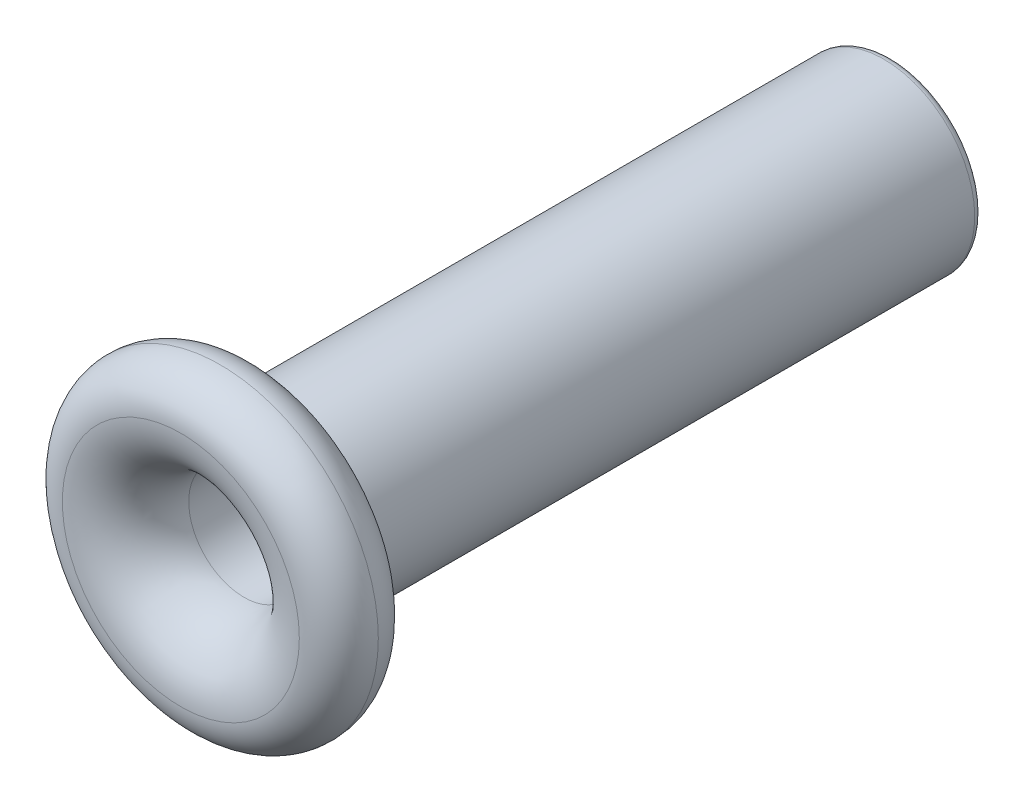
ISO-10303-21;
HEADER;
FILE_DESCRIPTION(('STEP AP214'),'2;1');
FILE_NAME('part.step','',(''),(''),'','','');
FILE_SCHEMA(('AUTOMOTIVE_DESIGN { 1 0 10303 214 1 1 1 1 }'));
ENDSEC;
DATA;
#1=APPLICATION_CONTEXT('core data for automotive mechanical design processes');
#2=APPLICATION_PROTOCOL_DEFINITION('international standard','automotive_design',2000,#1);
#3=PRODUCT_CONTEXT('',#1,'mechanical');
#4=PRODUCT('Part','Part','',(#3));
#5=PRODUCT_RELATED_PRODUCT_CATEGORY('part','',(#4));
#6=PRODUCT_DEFINITION_FORMATION('','',#4);
#7=PRODUCT_DEFINITION_CONTEXT('part definition',#1,'design');
#8=PRODUCT_DEFINITION('design','',#6,#7);
#9=PRODUCT_DEFINITION_SHAPE('','',#8);
#10=(LENGTH_UNIT() NAMED_UNIT(*) SI_UNIT(.MILLI.,.METRE.));
#11=(NAMED_UNIT(*) PLANE_ANGLE_UNIT() SI_UNIT($,.RADIAN.));
#12=(NAMED_UNIT(*) SI_UNIT($,.STERADIAN.) SOLID_ANGLE_UNIT());
#13=UNCERTAINTY_MEASURE_WITH_UNIT(LENGTH_MEASURE(1.E-05),#10,'distance_accuracy_value','');
#14=(GEOMETRIC_REPRESENTATION_CONTEXT(3) GLOBAL_UNCERTAINTY_ASSIGNED_CONTEXT((#13)) GLOBAL_UNIT_ASSIGNED_CONTEXT((#10,
#11,#12)) REPRESENTATION_CONTEXT('',''));
#15=CARTESIAN_POINT('',(0.,0.,0.));
#16=DIRECTION('',(0.,0.,1.));
#17=DIRECTION('',(1.,0.,0.));
#18=AXIS2_PLACEMENT_3D('',#15,#16,#17);
#19=CARTESIAN_POINT('',(0.,0.,80.));
#20=DIRECTION('',(0.,0.,-1.));
#21=DIRECTION('',(-1.,0.,0.));
#22=AXIS2_PLACEMENT_3D('',#19,#20,#21);
#23=CYLINDRICAL_SURFACE('',#22,11.5);
#24=CARTESIAN_POINT('',(0.,0.,1.));
#25=DIRECTION('',(0.,0.,1.));
#26=DIRECTION('',(1.,0.,0.));
#27=AXIS2_PLACEMENT_3D('',#24,#25,#26);
#28=CIRCLE('',#27,11.5);
#29=CARTESIAN_POINT('',(11.5,0.,1.));
#30=VERTEX_POINT('',#29);
#31=EDGE_CURVE('E70',#30,#30,#28,.T.);
#32=ORIENTED_EDGE('',*,*,#31,.T.);
#33=EDGE_LOOP('',(#32));
#34=FACE_BOUND('',#33,.T.);
#35=CARTESIAN_POINT('',(0.,0.,80.));
#36=DIRECTION('',(0.,0.,1.));
#37=DIRECTION('',(1.,0.,0.));
#38=AXIS2_PLACEMENT_3D('',#35,#36,#37);
#39=CIRCLE('',#38,11.5);
#40=CARTESIAN_POINT('',(11.5,0.,80.));
#41=VERTEX_POINT('',#40);
#42=EDGE_CURVE('E51',#41,#41,#39,.T.);
#43=ORIENTED_EDGE('',*,*,#42,.F.);
#44=EDGE_LOOP('',(#43));
#45=FACE_BOUND('',#44,.T.);
#46=ADVANCED_FACE('F31',(#34,#45),#23,.T.);
#47=CARTESIAN_POINT('',(0.,0.,0.));
#48=DIRECTION('',(0.,0.,1.));
#49=DIRECTION('',(1.,0.,0.));
#50=AXIS2_PLACEMENT_3D('',#47,#48,#49);
#51=PLANE('',#50);
#52=CARTESIAN_POINT('',(0.,0.,0.));
#53=DIRECTION('',(0.,0.,1.));
#54=DIRECTION('',(1.,0.,0.));
#55=AXIS2_PLACEMENT_3D('',#52,#53,#54);
#56=CIRCLE('',#55,10.5);
#57=CARTESIAN_POINT('',(10.5,0.,0.));
#58=VERTEX_POINT('',#57);
#59=EDGE_CURVE('E64',#58,#58,#56,.F.);
#60=ORIENTED_EDGE('',*,*,#59,.T.);
#61=EDGE_LOOP('',(#60));
#62=FACE_BOUND('',#61,.T.);
#63=CARTESIAN_POINT('',(0.,0.,0.));
#64=DIRECTION('',(0.,0.,1.));
#65=DIRECTION('',(1.,0.,0.));
#66=AXIS2_PLACEMENT_3D('',#63,#64,#65);
#67=CIRCLE('',#66,10.);
#68=CARTESIAN_POINT('',(10.,0.,0.));
#69=VERTEX_POINT('',#68);
#70=EDGE_CURVE('E67',#69,#69,#67,.T.);
#71=ORIENTED_EDGE('',*,*,#70,.T.);
#72=EDGE_LOOP('',(#71));
#73=FACE_BOUND('',#72,.T.);
#74=ADVANCED_FACE('F79',(#62,#73),#51,.F.);
#75=CARTESIAN_POINT('',(0.,0.,10.));
#76=DIRECTION('',(0.,0.,-1.));
#77=DIRECTION('',(-1.,0.,0.));
#78=AXIS2_PLACEMENT_3D('',#75,#76,#77);
#79=CYLINDRICAL_SURFACE('',#78,9.);
#80=CARTESIAN_POINT('',(0.,0.,9.));
#81=DIRECTION('',(0.,0.,-1.));
#82=DIRECTION('',(-1.,0.,0.));
#83=AXIS2_PLACEMENT_3D('',#80,#81,#82);
#84=CIRCLE('',#83,9.);
#85=CARTESIAN_POINT('',(-9.,0.,9.));
#86=VERTEX_POINT('',#85);
#87=EDGE_CURVE('E55',#86,#86,#84,.F.);
#88=ORIENTED_EDGE('',*,*,#87,.T.);
#89=EDGE_LOOP('',(#88));
#90=FACE_BOUND('',#89,.T.);
#91=CARTESIAN_POINT('',(0.,0.,0.999999999999999));
#92=DIRECTION('',(0.,0.,1.));
#93=DIRECTION('',(1.,0.,0.));
#94=AXIS2_PLACEMENT_3D('',#91,#92,#93);
#95=CIRCLE('',#94,9.);
#96=CARTESIAN_POINT('',(9.,0.,0.999999999999999));
#97=VERTEX_POINT('',#96);
#98=EDGE_CURVE('E61',#97,#97,#95,.F.);
#99=ORIENTED_EDGE('',*,*,#98,.T.);
#100=EDGE_LOOP('',(#99));
#101=FACE_BOUND('',#100,.T.);
#102=ADVANCED_FACE('F85',(#90,#101),#79,.F.);
#103=CARTESIAN_POINT('',(0.,0.,10.));
#104=DIRECTION('',(0.,0.,-1.));
#105=DIRECTION('',(-1.,0.,0.));
#106=AXIS2_PLACEMENT_3D('',#103,#104,#105);
#107=PLANE('',#106);
#108=CARTESIAN_POINT('',(0.,0.,10.));
#109=DIRECTION('',(0.,0.,-1.));
#110=DIRECTION('',(-1.,0.,0.));
#111=AXIS2_PLACEMENT_3D('',#108,#109,#110);
#112=CIRCLE('',#111,8.);
#113=CARTESIAN_POINT('',(-8.,0.,10.));
#114=VERTEX_POINT('',#113);
#115=EDGE_CURVE('E58',#114,#114,#112,.T.);
#116=ORIENTED_EDGE('',*,*,#115,.T.);
#117=EDGE_LOOP('',(#116));
#118=FACE_BOUND('',#117,.T.);
#119=ADVANCED_FACE('F94',(#118),#107,.T.);
#120=CARTESIAN_POINT('',(0.,0.,1.));
#121=DIRECTION('',(0.,0.,1.));
#122=DIRECTION('',(1.,0.,0.));
#123=AXIS2_PLACEMENT_3D('',#120,#121,#122);
#124=TOROIDAL_SURFACE('',#123,10.5,1.);
#125=ORIENTED_EDGE('',*,*,#59,.F.);
#126=EDGE_LOOP('',(#125));
#127=FACE_BOUND('',#126,.T.);
#128=ORIENTED_EDGE('',*,*,#31,.F.);
#129=EDGE_LOOP('',(#128));
#130=FACE_BOUND('',#129,.T.);
#131=ADVANCED_FACE('F90',(#127,#130),#124,.T.);
#132=CARTESIAN_POINT('',(0.,0.,0.999999999999999));
#133=DIRECTION('',(0.,0.,1.));
#134=DIRECTION('',(1.,0.,0.));
#135=AXIS2_PLACEMENT_3D('',#132,#133,#134);
#136=TOROIDAL_SURFACE('',#135,10.,1.);
#137=ORIENTED_EDGE('',*,*,#70,.F.);
#138=EDGE_LOOP('',(#137));
#139=FACE_BOUND('',#138,.T.);
#140=ORIENTED_EDGE('',*,*,#98,.F.);
#141=EDGE_LOOP('',(#140));
#142=FACE_BOUND('',#141,.T.);
#143=ADVANCED_FACE('F93',(#139,#142),#136,.T.);
#144=CARTESIAN_POINT('',(0.,0.,9.));
#145=DIRECTION('',(0.,0.,-1.));
#146=DIRECTION('',(-1.,0.,0.));
#147=AXIS2_PLACEMENT_3D('',#144,#145,#146);
#148=TOROIDAL_SURFACE('',#147,8.,1.);
#149=ORIENTED_EDGE('',*,*,#87,.F.);
#150=EDGE_LOOP('',(#149));
#151=FACE_BOUND('',#150,.T.);
#152=ORIENTED_EDGE('',*,*,#115,.F.);
#153=EDGE_LOOP('',(#152));
#154=FACE_BOUND('',#153,.T.);
#155=ADVANCED_FACE('F98',(#151,#154),#148,.F.);
#156=CARTESIAN_POINT('',(0.,0.,80.));
#157=DIRECTION('',(0.,0.,1.));
#158=DIRECTION('',(1.,0.,0.));
#159=AXIS2_PLACEMENT_3D('',#156,#157,#158);
#160=PLANE('',#159);
#161=CARTESIAN_POINT('',(0.,0.,80.));
#162=DIRECTION('',(0.,0.,1.));
#163=DIRECTION('',(1.,0.,0.));
#164=AXIS2_PLACEMENT_3D('',#161,#162,#163);
#165=CIRCLE('',#164,15.);
#166=CARTESIAN_POINT('',(15.,0.,80.));
#167=VERTEX_POINT('',#166);
#168=EDGE_CURVE('E42',#167,#167,#165,.F.);
#169=ORIENTED_EDGE('',*,*,#168,.T.);
#170=EDGE_LOOP('',(#169));
#171=FACE_BOUND('',#170,.T.);
#172=ORIENTED_EDGE('',*,*,#42,.T.);
#173=EDGE_LOOP('',(#172));
#174=FACE_BOUND('',#173,.T.);
#175=ADVANCED_FACE('F76',(#171,#174),#160,.F.);
#176=CARTESIAN_POINT('',(0.,0.,85.));
#177=DIRECTION('',(0.,0.,1.));
#178=DIRECTION('',(1.,0.,0.));
#179=AXIS2_PLACEMENT_3D('',#176,#177,#178);
#180=TOROIDAL_SURFACE('',#179,15.,5.);
#181=ORIENTED_EDGE('',*,*,#168,.F.);
#182=EDGE_LOOP('',(#181));
#183=FACE_BOUND('',#182,.T.);
#184=CARTESIAN_POINT('',(0.,0.,85.));
#185=DIRECTION('',(0.,0.,1.));
#186=DIRECTION('',(1.,0.,0.));
#187=AXIS2_PLACEMENT_3D('',#184,#185,#186);
#188=CIRCLE('',#187,20.);
#189=CARTESIAN_POINT('',(20.,0.,85.));
#190=VERTEX_POINT('',#189);
#191=EDGE_CURVE('E49',#190,#190,#188,.T.);
#192=ORIENTED_EDGE('',*,*,#191,.F.);
#193=EDGE_LOOP('',(#192));
#194=FACE_BOUND('',#193,.T.);
#195=ADVANCED_FACE('F107',(#183,#194),#180,.T.);
#196=CARTESIAN_POINT('',(0.,0.,85.));
#197=DIRECTION('',(0.,0.,1.));
#198=DIRECTION('',(1.,0.,0.));
#199=AXIS2_PLACEMENT_3D('',#196,#197,#198);
#200=TOROIDAL_SURFACE('',#199,15.,5.);
#201=ORIENTED_EDGE('',*,*,#191,.T.);
#202=EDGE_LOOP('',(#201));
#203=FACE_BOUND('',#202,.T.);
#204=CARTESIAN_POINT('',(0.,0.,90.));
#205=DIRECTION('',(0.,0.,1.));
#206=DIRECTION('',(1.,0.,0.));
#207=AXIS2_PLACEMENT_3D('',#204,#205,#206);
#208=CIRCLE('',#207,15.);
#209=CARTESIAN_POINT('',(15.,0.,90.));
#210=VERTEX_POINT('',#209);
#211=EDGE_CURVE('E46',#210,#210,#208,.T.);
#212=ORIENTED_EDGE('',*,*,#211,.F.);
#213=EDGE_LOOP('',(#212));
#214=FACE_BOUND('',#213,.T.);
#215=ADVANCED_FACE('F103',(#203,#214),#200,.T.);
#216=CARTESIAN_POINT('',(0.,0.,15.));
#217=DIRECTION('',(0.,0.,1.));
#218=DIRECTION('',(1.,0.,0.));
#219=AXIS2_PLACEMENT_3D('',#216,#217,#218);
#220=CYLINDRICAL_SURFACE('',#219,7.);
#221=CARTESIAN_POINT('',(0.,0.,82.));
#222=DIRECTION('',(0.,0.,1.));
#223=DIRECTION('',(1.,0.,0.));
#224=AXIS2_PLACEMENT_3D('',#221,#222,#223);
#225=CIRCLE('',#224,7.);
#226=CARTESIAN_POINT('',(7.,0.,82.));
#227=VERTEX_POINT('',#226);
#228=EDGE_CURVE('E10',#227,#227,#225,.T.);
#229=ORIENTED_EDGE('',*,*,#228,.T.);
#230=EDGE_LOOP('',(#229));
#231=FACE_BOUND('',#230,.T.);
#232=CARTESIAN_POINT('',(0.,0.,22.));
#233=DIRECTION('',(0.,0.,1.));
#234=DIRECTION('',(1.,0.,0.));
#235=AXIS2_PLACEMENT_3D('',#232,#233,#234);
#236=CIRCLE('',#235,7.);
#237=CARTESIAN_POINT('',(7.,0.,22.));
#238=VERTEX_POINT('',#237);
#239=EDGE_CURVE('E38',#238,#238,#236,.F.);
#240=ORIENTED_EDGE('',*,*,#239,.T.);
#241=EDGE_LOOP('',(#240));
#242=FACE_BOUND('',#241,.T.);
#243=ADVANCED_FACE('F106',(#231,#242),#220,.F.);
#244=CARTESIAN_POINT('',(0.,0.,22.));
#245=DIRECTION('',(0.,0.,1.));
#246=DIRECTION('',(1.,0.,0.));
#247=AXIS2_PLACEMENT_3D('',#244,#245,#246);
#248=SPHERICAL_SURFACE('',#247,7.);
#249=ORIENTED_EDGE('',*,*,#239,.F.);
#250=EDGE_LOOP('',(#249));
#251=FACE_BOUND('',#250,.T.);
#252=ADVANCED_FACE('F111',(#251),#248,.F.);
#253=CARTESIAN_POINT('',(0.,0.,82.));
#254=DIRECTION('',(0.,0.,1.));
#255=DIRECTION('',(1.,0.,0.));
#256=AXIS2_PLACEMENT_3D('',#253,#254,#255);
#257=TOROIDAL_SURFACE('',#256,15.,8.);
#258=ORIENTED_EDGE('',*,*,#211,.T.);
#259=EDGE_LOOP('',(#258));
#260=FACE_BOUND('',#259,.T.);
#261=ORIENTED_EDGE('',*,*,#228,.F.);
#262=EDGE_LOOP('',(#261));
#263=FACE_BOUND('',#262,.T.);
#264=ADVANCED_FACE('F33',(#260,#263),#257,.T.);
#265=CLOSED_SHELL('',(#46,#74,#102,#119,#131,#143,#155,#175,#195,#215,#243,#252,#264));
#266=MANIFOLD_SOLID_BREP('B2',#265);
#267=ADVANCED_BREP_SHAPE_REPRESENTATION('',(#18,#266),#14);
#268=SHAPE_DEFINITION_REPRESENTATION(#9,#267);
ENDSEC;
END-ISO-10303-21;
